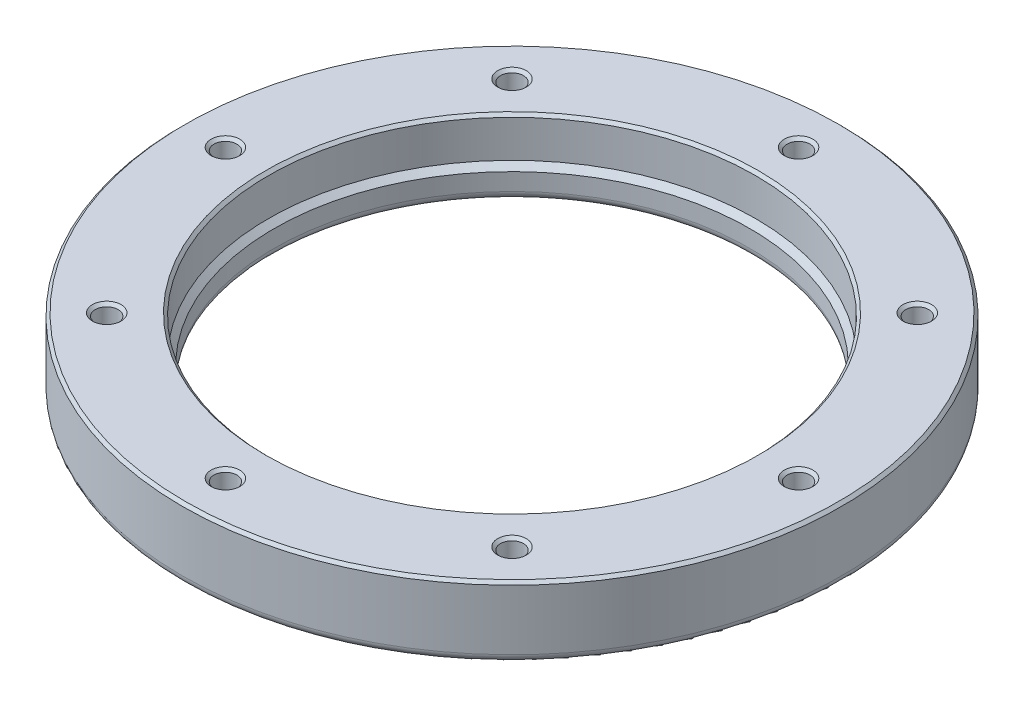
ISO-10303-21;
HEADER;
FILE_DESCRIPTION(('STEP AP214'),'2;1');
FILE_NAME('part.step','',(''),(''),'','','');
FILE_SCHEMA(('AUTOMOTIVE_DESIGN { 1 0 10303 214 1 1 1 1 }'));
ENDSEC;
DATA;
#1=APPLICATION_CONTEXT('core data for automotive mechanical design processes');
#2=APPLICATION_PROTOCOL_DEFINITION('international standard','automotive_design',2000,#1);
#3=PRODUCT_CONTEXT('',#1,'mechanical');
#4=PRODUCT('Part','Part','',(#3));
#5=PRODUCT_RELATED_PRODUCT_CATEGORY('part','',(#4));
#6=PRODUCT_DEFINITION_FORMATION('','',#4);
#7=PRODUCT_DEFINITION_CONTEXT('part definition',#1,'design');
#8=PRODUCT_DEFINITION('design','',#6,#7);
#9=PRODUCT_DEFINITION_SHAPE('','',#8);
#10=(LENGTH_UNIT() NAMED_UNIT(*) SI_UNIT(.MILLI.,.METRE.));
#11=(NAMED_UNIT(*) PLANE_ANGLE_UNIT() SI_UNIT($,.RADIAN.));
#12=(NAMED_UNIT(*) SI_UNIT($,.STERADIAN.) SOLID_ANGLE_UNIT());
#13=UNCERTAINTY_MEASURE_WITH_UNIT(LENGTH_MEASURE(1.E-05),#10,'distance_accuracy_value','');
#14=(GEOMETRIC_REPRESENTATION_CONTEXT(3) GLOBAL_UNCERTAINTY_ASSIGNED_CONTEXT((#13)) GLOBAL_UNIT_ASSIGNED_CONTEXT((#10,
#11,#12)) REPRESENTATION_CONTEXT('',''));
#15=CARTESIAN_POINT('',(0.,0.,0.));
#16=DIRECTION('',(0.,0.,1.));
#17=DIRECTION('',(1.,0.,0.));
#18=AXIS2_PLACEMENT_3D('',#15,#16,#17);
#19=CARTESIAN_POINT('',(0.,25.,0.));
#20=DIRECTION('',(0.,-1.,0.));
#21=DIRECTION('',(0.,0.,-1.));
#22=AXIS2_PLACEMENT_3D('',#19,#20,#21);
#23=CYLINDRICAL_SURFACE('',#22,115.);
#24=CARTESIAN_POINT('',(0.,3.,0.));
#25=DIRECTION('',(0.,1.,0.));
#26=DIRECTION('',(0.,0.,1.));
#27=AXIS2_PLACEMENT_3D('',#24,#25,#26);
#28=CIRCLE('',#27,115.);
#29=CARTESIAN_POINT('',(0.,3.,115.));
#30=VERTEX_POINT('',#29);
#31=EDGE_CURVE('E91',#30,#30,#28,.T.);
#32=ORIENTED_EDGE('',*,*,#31,.T.);
#33=EDGE_LOOP('',(#32));
#34=FACE_BOUND('',#33,.T.);
#35=CARTESIAN_POINT('',(0.,24.,0.));
#36=DIRECTION('',(0.,1.,0.));
#37=DIRECTION('',(0.,0.,1.));
#38=AXIS2_PLACEMENT_3D('',#35,#36,#37);
#39=CIRCLE('',#38,115.);
#40=CARTESIAN_POINT('',(0.,24.,115.));
#41=VERTEX_POINT('',#40);
#42=EDGE_CURVE('E106',#41,#41,#39,.F.);
#43=ORIENTED_EDGE('',*,*,#42,.T.);
#44=EDGE_LOOP('',(#43));
#45=FACE_BOUND('',#44,.T.);
#46=ADVANCED_FACE('F34',(#34,#45),#23,.T.);
#47=CARTESIAN_POINT('',(0.,25.,0.));
#48=DIRECTION('',(0.,1.,0.));
#49=DIRECTION('',(0.,0.,1.));
#50=AXIS2_PLACEMENT_3D('',#47,#48,#49);
#51=PLANE('',#50);
#52=CARTESIAN_POINT('',(70.7106781186547,25.,-70.7106781186548));
#53=DIRECTION('',(0.,1.,0.));
#54=DIRECTION('',(0.,0.,1.));
#55=AXIS2_PLACEMENT_3D('',#52,#53,#54);
#56=CIRCLE('',#55,5.00000000000003);
#57=CARTESIAN_POINT('',(70.7106781186547,25.,-65.7106781186547));
#58=VERTEX_POINT('',#57);
#59=EDGE_CURVE('E64',#58,#58,#56,.F.);
#60=ORIENTED_EDGE('',*,*,#59,.T.);
#61=EDGE_LOOP('',(#60));
#62=FACE_BOUND('',#61,.T.);
#63=CARTESIAN_POINT('',(100.,25.,0.));
#64=DIRECTION('',(0.,1.,0.));
#65=DIRECTION('',(0.,0.,1.));
#66=AXIS2_PLACEMENT_3D('',#63,#64,#65);
#67=CIRCLE('',#66,5.);
#68=CARTESIAN_POINT('',(100.,25.,4.99999999999998));
#69=VERTEX_POINT('',#68);
#70=EDGE_CURVE('E67',#69,#69,#67,.F.);
#71=ORIENTED_EDGE('',*,*,#70,.T.);
#72=EDGE_LOOP('',(#71));
#73=FACE_BOUND('',#72,.T.);
#74=CARTESIAN_POINT('',(70.7106781186548,25.,70.7106781186547));
#75=DIRECTION('',(0.,1.,0.));
#76=DIRECTION('',(0.,0.,1.));
#77=AXIS2_PLACEMENT_3D('',#74,#75,#76);
#78=CIRCLE('',#77,5.);
#79=CARTESIAN_POINT('',(70.7106781186548,25.,75.7106781186547));
#80=VERTEX_POINT('',#79);
#81=EDGE_CURVE('E70',#80,#80,#78,.F.);
#82=ORIENTED_EDGE('',*,*,#81,.T.);
#83=EDGE_LOOP('',(#82));
#84=FACE_BOUND('',#83,.T.);
#85=CARTESIAN_POINT('',(0.,25.,100.));
#86=DIRECTION('',(0.,1.,0.));
#87=DIRECTION('',(0.,0.,1.));
#88=AXIS2_PLACEMENT_3D('',#85,#86,#87);
#89=CIRCLE('',#88,5.);
#90=CARTESIAN_POINT('',(0.,25.,105.));
#91=VERTEX_POINT('',#90);
#92=EDGE_CURVE('E73',#91,#91,#89,.F.);
#93=ORIENTED_EDGE('',*,*,#92,.T.);
#94=EDGE_LOOP('',(#93));
#95=FACE_BOUND('',#94,.T.);
#96=CARTESIAN_POINT('',(-70.7106781186547,25.,70.7106781186548));
#97=DIRECTION('',(0.,1.,0.));
#98=DIRECTION('',(0.,0.,1.));
#99=AXIS2_PLACEMENT_3D('',#96,#97,#98);
#100=CIRCLE('',#99,5.);
#101=CARTESIAN_POINT('',(-70.7106781186547,25.,75.7106781186548));
#102=VERTEX_POINT('',#101);
#103=EDGE_CURVE('E76',#102,#102,#100,.F.);
#104=ORIENTED_EDGE('',*,*,#103,.T.);
#105=EDGE_LOOP('',(#104));
#106=FACE_BOUND('',#105,.T.);
#107=CARTESIAN_POINT('',(-100.,25.,0.));
#108=DIRECTION('',(0.,1.,0.));
#109=DIRECTION('',(0.,0.,1.));
#110=AXIS2_PLACEMENT_3D('',#107,#108,#109);
#111=CIRCLE('',#110,5.);
#112=CARTESIAN_POINT('',(-100.,25.,5.00000000000002));
#113=VERTEX_POINT('',#112);
#114=EDGE_CURVE('E79',#113,#113,#111,.F.);
#115=ORIENTED_EDGE('',*,*,#114,.T.);
#116=EDGE_LOOP('',(#115));
#117=FACE_BOUND('',#116,.T.);
#118=CARTESIAN_POINT('',(0.,25.,-100.));
#119=DIRECTION('',(0.,1.,0.));
#120=DIRECTION('',(0.,0.,1.));
#121=AXIS2_PLACEMENT_3D('',#118,#119,#120);
#122=CIRCLE('',#121,5.);
#123=CARTESIAN_POINT('',(0.,25.,-95.));
#124=VERTEX_POINT('',#123);
#125=EDGE_CURVE('E82',#124,#124,#122,.F.);
#126=ORIENTED_EDGE('',*,*,#125,.T.);
#127=EDGE_LOOP('',(#126));
#128=FACE_BOUND('',#127,.T.);
#129=CARTESIAN_POINT('',(-70.7106781186548,25.,-70.7106781186548));
#130=DIRECTION('',(0.,1.,0.));
#131=DIRECTION('',(0.,0.,1.));
#132=AXIS2_PLACEMENT_3D('',#129,#130,#131);
#133=CIRCLE('',#132,5.);
#134=CARTESIAN_POINT('',(-70.7106781186548,25.,-65.7106781186547));
#135=VERTEX_POINT('',#134);
#136=EDGE_CURVE('E85',#135,#135,#133,.F.);
#137=ORIENTED_EDGE('',*,*,#136,.T.);
#138=EDGE_LOOP('',(#137));
#139=FACE_BOUND('',#138,.T.);
#140=CARTESIAN_POINT('',(0.,25.,0.));
#141=DIRECTION('',(0.,1.,0.));
#142=DIRECTION('',(0.,0.,1.));
#143=AXIS2_PLACEMENT_3D('',#140,#141,#142);
#144=CIRCLE('',#143,114.);
#145=CARTESIAN_POINT('',(0.,25.,114.));
#146=VERTEX_POINT('',#145);
#147=EDGE_CURVE('E109',#146,#146,#144,.T.);
#148=ORIENTED_EDGE('',*,*,#147,.T.);
#149=EDGE_LOOP('',(#148));
#150=FACE_BOUND('',#149,.T.);
#151=CARTESIAN_POINT('',(0.,25.,0.));
#152=DIRECTION('',(0.,1.,0.));
#153=DIRECTION('',(0.,0.,1.));
#154=AXIS2_PLACEMENT_3D('',#151,#152,#153);
#155=CIRCLE('',#154,86.);
#156=CARTESIAN_POINT('',(0.,25.,86.));
#157=VERTEX_POINT('',#156);
#158=EDGE_CURVE('E112',#157,#157,#155,.F.);
#159=ORIENTED_EDGE('',*,*,#158,.T.);
#160=EDGE_LOOP('',(#159));
#161=FACE_BOUND('',#160,.T.);
#162=ADVANCED_FACE('F208',(#62,#73,#84,#95,#106,#117,#128,#139,#150,#161),#51,.T.);
#163=CARTESIAN_POINT('',(0.,0.,0.));
#164=DIRECTION('',(0.,1.,0.));
#165=DIRECTION('',(0.,0.,1.));
#166=AXIS2_PLACEMENT_3D('',#163,#164,#165);
#167=PLANE('',#166);
#168=CARTESIAN_POINT('',(-100.,0.,0.));
#169=DIRECTION('',(0.,-1.,0.));
#170=DIRECTION('',(0.,0.,-1.));
#171=AXIS2_PLACEMENT_3D('',#168,#169,#170);
#172=CIRCLE('',#171,6.);
#173=CARTESIAN_POINT('',(-100.,0.,-6.00000000000002));
#174=VERTEX_POINT('',#173);
#175=EDGE_CURVE('E188',#174,#174,#172,.T.);
#176=ORIENTED_EDGE('',*,*,#175,.F.);
#177=EDGE_LOOP('',(#176));
#178=FACE_BOUND('',#177,.T.);
#179=CARTESIAN_POINT('',(-70.7106781186548,0.,70.7106781186548));
#180=DIRECTION('',(0.,-1.,0.));
#181=DIRECTION('',(0.,0.,-1.));
#182=AXIS2_PLACEMENT_3D('',#179,#180,#181);
#183=CIRCLE('',#182,6.);
#184=CARTESIAN_POINT('',(-70.7106781186548,0.,64.7106781186547));
#185=VERTEX_POINT('',#184);
#186=EDGE_CURVE('E182',#185,#185,#183,.T.);
#187=ORIENTED_EDGE('',*,*,#186,.F.);
#188=EDGE_LOOP('',(#187));
#189=FACE_BOUND('',#188,.T.);
#190=CARTESIAN_POINT('',(0.,0.,100.));
#191=DIRECTION('',(0.,-1.,0.));
#192=DIRECTION('',(0.,0.,-1.));
#193=AXIS2_PLACEMENT_3D('',#190,#191,#192);
#194=CIRCLE('',#193,6.);
#195=CARTESIAN_POINT('',(0.,0.,94.));
#196=VERTEX_POINT('',#195);
#197=EDGE_CURVE('E176',#196,#196,#194,.T.);
#198=ORIENTED_EDGE('',*,*,#197,.F.);
#199=EDGE_LOOP('',(#198));
#200=FACE_BOUND('',#199,.T.);
#201=CARTESIAN_POINT('',(70.7106781186547,0.,70.7106781186548));
#202=DIRECTION('',(0.,-1.,0.));
#203=DIRECTION('',(0.,0.,-1.));
#204=AXIS2_PLACEMENT_3D('',#201,#202,#203);
#205=CIRCLE('',#204,5.99999999999999);
#206=CARTESIAN_POINT('',(70.7106781186547,0.,64.7106781186548));
#207=VERTEX_POINT('',#206);
#208=EDGE_CURVE('E170',#207,#207,#205,.T.);
#209=ORIENTED_EDGE('',*,*,#208,.F.);
#210=EDGE_LOOP('',(#209));
#211=FACE_BOUND('',#210,.T.);
#212=CARTESIAN_POINT('',(100.,0.,0.));
#213=DIRECTION('',(0.,-1.,0.));
#214=DIRECTION('',(0.,0.,-1.));
#215=AXIS2_PLACEMENT_3D('',#212,#213,#214);
#216=CIRCLE('',#215,6.);
#217=CARTESIAN_POINT('',(100.,0.,-5.99999999999998));
#218=VERTEX_POINT('',#217);
#219=EDGE_CURVE('E164',#218,#218,#216,.T.);
#220=ORIENTED_EDGE('',*,*,#219,.F.);
#221=EDGE_LOOP('',(#220));
#222=FACE_BOUND('',#221,.T.);
#223=CARTESIAN_POINT('',(70.7106781186548,0.,-70.7106781186547));
#224=DIRECTION('',(0.,-1.,0.));
#225=DIRECTION('',(0.,0.,-1.));
#226=AXIS2_PLACEMENT_3D('',#223,#224,#225);
#227=CIRCLE('',#226,6.);
#228=CARTESIAN_POINT('',(70.7106781186548,0.,-76.7106781186547));
#229=VERTEX_POINT('',#228);
#230=EDGE_CURVE('E158',#229,#229,#227,.T.);
#231=ORIENTED_EDGE('',*,*,#230,.F.);
#232=EDGE_LOOP('',(#231));
#233=FACE_BOUND('',#232,.T.);
#234=CARTESIAN_POINT('',(0.,0.,-100.));
#235=DIRECTION('',(0.,-1.,0.));
#236=DIRECTION('',(0.,0.,-1.));
#237=AXIS2_PLACEMENT_3D('',#234,#235,#236);
#238=CIRCLE('',#237,6.);
#239=CARTESIAN_POINT('',(0.,0.,-106.));
#240=VERTEX_POINT('',#239);
#241=EDGE_CURVE('E152',#240,#240,#238,.T.);
#242=ORIENTED_EDGE('',*,*,#241,.F.);
#243=EDGE_LOOP('',(#242));
#244=FACE_BOUND('',#243,.T.);
#245=CARTESIAN_POINT('',(-70.7106781186547,0.,-70.7106781186548));
#246=DIRECTION('',(0.,-1.,0.));
#247=DIRECTION('',(0.,0.,-1.));
#248=AXIS2_PLACEMENT_3D('',#245,#246,#247);
#249=CIRCLE('',#248,6.);
#250=CARTESIAN_POINT('',(-70.7106781186547,0.,-76.7106781186548));
#251=VERTEX_POINT('',#250);
#252=EDGE_CURVE('E146',#251,#251,#249,.T.);
#253=ORIENTED_EDGE('',*,*,#252,.F.);
#254=EDGE_LOOP('',(#253));
#255=FACE_BOUND('',#254,.T.);
#256=CARTESIAN_POINT('',(0.,0.,0.));
#257=DIRECTION('',(0.,1.,0.));
#258=DIRECTION('',(0.,0.,1.));
#259=AXIS2_PLACEMENT_3D('',#256,#257,#258);
#260=CIRCLE('',#259,86.);
#261=CARTESIAN_POINT('',(0.,0.,86.));
#262=VERTEX_POINT('',#261);
#263=EDGE_CURVE('E97',#262,#262,#260,.T.);
#264=ORIENTED_EDGE('',*,*,#263,.T.);
#265=EDGE_LOOP('',(#264));
#266=FACE_BOUND('',#265,.T.);
#267=CARTESIAN_POINT('',(0.,0.,0.));
#268=DIRECTION('',(0.,1.,0.));
#269=DIRECTION('',(0.,0.,1.));
#270=AXIS2_PLACEMENT_3D('',#267,#268,#269);
#271=CIRCLE('',#270,112.);
#272=CARTESIAN_POINT('',(0.,0.,112.));
#273=VERTEX_POINT('',#272);
#274=EDGE_CURVE('E100',#273,#273,#271,.F.);
#275=ORIENTED_EDGE('',*,*,#274,.T.);
#276=EDGE_LOOP('',(#275));
#277=FACE_BOUND('',#276,.T.);
#278=ADVANCED_FACE('F204',(#178,#189,#200,#211,#222,#233,#244,#255,#266,#277),#167,.F.);
#279=CARTESIAN_POINT('',(0.,9.,0.));
#280=DIRECTION('',(0.,1.,0.));
#281=DIRECTION('',(0.,0.,1.));
#282=AXIS2_PLACEMENT_3D('',#279,#280,#281);
#283=CYLINDRICAL_SURFACE('',#282,85.);
#284=CARTESIAN_POINT('',(0.,24.,0.));
#285=DIRECTION('',(0.,1.,0.));
#286=DIRECTION('',(0.,0.,1.));
#287=AXIS2_PLACEMENT_3D('',#284,#285,#286);
#288=CIRCLE('',#287,85.);
#289=CARTESIAN_POINT('',(0.,24.,85.));
#290=VERTEX_POINT('',#289);
#291=EDGE_CURVE('E103',#290,#290,#288,.T.);
#292=ORIENTED_EDGE('',*,*,#291,.T.);
#293=EDGE_LOOP('',(#292));
#294=FACE_BOUND('',#293,.T.);
#295=CARTESIAN_POINT('',(0.,10.9999999999999,0.));
#296=DIRECTION('',(0.,1.,0.));
#297=DIRECTION('',(0.,0.,1.));
#298=AXIS2_PLACEMENT_3D('',#295,#296,#297);
#299=CIRCLE('',#298,85.);
#300=CARTESIAN_POINT('',(0.,10.9999999999999,85.));
#301=VERTEX_POINT('',#300);
#302=EDGE_CURVE('E115',#301,#301,#299,.F.);
#303=ORIENTED_EDGE('',*,*,#302,.T.);
#304=EDGE_LOOP('',(#303));
#305=FACE_BOUND('',#304,.T.);
#306=ADVANCED_FACE('F207',(#294,#305),#283,.F.);
#307=CARTESIAN_POINT('',(0.,0.,0.));
#308=DIRECTION('',(0.,1.,0.));
#309=DIRECTION('',(0.,0.,1.));
#310=AXIS2_PLACEMENT_3D('',#307,#308,#309);
#311=CYLINDRICAL_SURFACE('',#310,83.);
#312=CARTESIAN_POINT('',(0.,3.,0.));
#313=DIRECTION('',(0.,1.,0.));
#314=DIRECTION('',(0.,0.,1.));
#315=AXIS2_PLACEMENT_3D('',#312,#313,#314);
#316=CIRCLE('',#315,83.);
#317=CARTESIAN_POINT('',(0.,3.,83.));
#318=VERTEX_POINT('',#317);
#319=EDGE_CURVE('E94',#318,#318,#316,.F.);
#320=ORIENTED_EDGE('',*,*,#319,.T.);
#321=EDGE_LOOP('',(#320));
#322=FACE_BOUND('',#321,.T.);
#323=CARTESIAN_POINT('',(0.,9.,0.));
#324=DIRECTION('',(0.,1.,0.));
#325=DIRECTION('',(0.,0.,1.));
#326=AXIS2_PLACEMENT_3D('',#323,#324,#325);
#327=CIRCLE('',#326,83.);
#328=CARTESIAN_POINT('',(0.,9.,83.));
#329=VERTEX_POINT('',#328);
#330=EDGE_CURVE('E118',#329,#329,#327,.T.);
#331=ORIENTED_EDGE('',*,*,#330,.T.);
#332=EDGE_LOOP('',(#331));
#333=FACE_BOUND('',#332,.T.);
#334=ADVANCED_FACE('F262',(#322,#333),#311,.F.);
#335=CARTESIAN_POINT('',(0.,9.,0.));
#336=DIRECTION('',(0.,1.,0.));
#337=DIRECTION('',(0.,0.,1.));
#338=AXIS2_PLACEMENT_3D('',#335,#336,#337);
#339=CONICAL_SURFACE('',#338,83.0000000000001,0.785398163397445);
#340=ORIENTED_EDGE('',*,*,#302,.F.);
#341=EDGE_LOOP('',(#340));
#342=FACE_BOUND('',#341,.T.);
#343=ORIENTED_EDGE('',*,*,#330,.F.);
#344=EDGE_LOOP('',(#343));
#345=FACE_BOUND('',#344,.T.);
#346=ADVANCED_FACE('F245',(#342,#345),#339,.F.);
#347=CARTESIAN_POINT('',(0.,25.,0.));
#348=DIRECTION('',(0.,-1.,0.));
#349=DIRECTION('',(0.,0.,-1.));
#350=AXIS2_PLACEMENT_3D('',#347,#348,#349);
#351=CONICAL_SURFACE('',#350,114.,0.785398163397462);
#352=ORIENTED_EDGE('',*,*,#42,.F.);
#353=EDGE_LOOP('',(#352));
#354=FACE_BOUND('',#353,.T.);
#355=ORIENTED_EDGE('',*,*,#147,.F.);
#356=EDGE_LOOP('',(#355));
#357=FACE_BOUND('',#356,.T.);
#358=ADVANCED_FACE('F241',(#354,#357),#351,.T.);
#359=CARTESIAN_POINT('',(0.,24.,0.));
#360=DIRECTION('',(0.,1.,0.));
#361=DIRECTION('',(0.,0.,1.));
#362=AXIS2_PLACEMENT_3D('',#359,#360,#361);
#363=CONICAL_SURFACE('',#362,85.,0.785398163397455);
#364=ORIENTED_EDGE('',*,*,#158,.F.);
#365=EDGE_LOOP('',(#364));
#366=FACE_BOUND('',#365,.T.);
#367=ORIENTED_EDGE('',*,*,#291,.F.);
#368=EDGE_LOOP('',(#367));
#369=FACE_BOUND('',#368,.T.);
#370=ADVANCED_FACE('F244',(#366,#369),#363,.F.);
#371=CARTESIAN_POINT('',(0.,3.,0.));
#372=DIRECTION('',(0.,1.,0.));
#373=DIRECTION('',(0.,0.,1.));
#374=AXIS2_PLACEMENT_3D('',#371,#372,#373);
#375=TOROIDAL_SURFACE('',#374,86.,3.);
#376=ORIENTED_EDGE('',*,*,#319,.F.);
#377=EDGE_LOOP('',(#376));
#378=FACE_BOUND('',#377,.T.);
#379=ORIENTED_EDGE('',*,*,#263,.F.);
#380=EDGE_LOOP('',(#379));
#381=FACE_BOUND('',#380,.T.);
#382=ADVANCED_FACE('F232',(#378,#381),#375,.T.);
#383=CARTESIAN_POINT('',(0.,3.,0.));
#384=DIRECTION('',(0.,1.,0.));
#385=DIRECTION('',(0.,0.,1.));
#386=AXIS2_PLACEMENT_3D('',#383,#384,#385);
#387=TOROIDAL_SURFACE('',#386,112.,3.);
#388=ORIENTED_EDGE('',*,*,#274,.F.);
#389=EDGE_LOOP('',(#388));
#390=FACE_BOUND('',#389,.T.);
#391=ORIENTED_EDGE('',*,*,#31,.F.);
#392=EDGE_LOOP('',(#391));
#393=FACE_BOUND('',#392,.T.);
#394=ADVANCED_FACE('F228',(#390,#393),#387,.T.);
#395=CARTESIAN_POINT('',(-70.7106781186547,10.,70.7106781186548));
#396=DIRECTION('',(0.,1.,0.));
#397=DIRECTION('',(0.,0.,1.));
#398=AXIS2_PLACEMENT_3D('',#395,#396,#397);
#399=CYLINDRICAL_SURFACE('',#398,4.00000000000001);
#400=CARTESIAN_POINT('',(-70.7106781186547,24.,70.7106781186548));
#401=DIRECTION('',(0.,1.,0.));
#402=DIRECTION('',(0.,0.,1.));
#403=AXIS2_PLACEMENT_3D('',#400,#401,#402);
#404=CIRCLE('',#403,4.00000000000001);
#405=CARTESIAN_POINT('',(-70.7106781186547,24.,74.7106781186548));
#406=VERTEX_POINT('',#405);
#407=EDGE_CURVE('E50',#406,#406,#404,.T.);
#408=ORIENTED_EDGE('',*,*,#407,.T.);
#409=EDGE_LOOP('',(#408));
#410=FACE_BOUND('',#409,.T.);
#411=CARTESIAN_POINT('',(-70.7106781186547,10.,70.7106781186548));
#412=DIRECTION('',(0.,1.,0.));
#413=DIRECTION('',(0.,0.,1.));
#414=AXIS2_PLACEMENT_3D('',#411,#412,#413);
#415=CIRCLE('',#414,4.00000000000001);
#416=CARTESIAN_POINT('',(-70.7106781186547,10.,74.7106781186548));
#417=VERTEX_POINT('',#416);
#418=EDGE_CURVE('E121',#417,#417,#415,.T.);
#419=ORIENTED_EDGE('',*,*,#418,.F.);
#420=EDGE_LOOP('',(#419));
#421=FACE_BOUND('',#420,.T.);
#422=ADVANCED_FACE('F231',(#410,#421),#399,.F.);
#423=CARTESIAN_POINT('',(0.,10.,100.));
#424=DIRECTION('',(0.,1.,0.));
#425=DIRECTION('',(0.,0.,1.));
#426=AXIS2_PLACEMENT_3D('',#423,#424,#425);
#427=CYLINDRICAL_SURFACE('',#426,4.00000000000001);
#428=CARTESIAN_POINT('',(0.,24.,100.));
#429=DIRECTION('',(0.,1.,0.));
#430=DIRECTION('',(0.,0.,1.));
#431=AXIS2_PLACEMENT_3D('',#428,#429,#430);
#432=CIRCLE('',#431,4.00000000000001);
#433=CARTESIAN_POINT('',(0.,24.,104.));
#434=VERTEX_POINT('',#433);
#435=EDGE_CURVE('E55',#434,#434,#432,.T.);
#436=ORIENTED_EDGE('',*,*,#435,.T.);
#437=EDGE_LOOP('',(#436));
#438=FACE_BOUND('',#437,.T.);
#439=CARTESIAN_POINT('',(0.,10.,100.));
#440=DIRECTION('',(0.,1.,0.));
#441=DIRECTION('',(0.,0.,1.));
#442=AXIS2_PLACEMENT_3D('',#439,#440,#441);
#443=CIRCLE('',#442,4.00000000000001);
#444=CARTESIAN_POINT('',(0.,10.,104.));
#445=VERTEX_POINT('',#444);
#446=EDGE_CURVE('E124',#445,#445,#443,.T.);
#447=ORIENTED_EDGE('',*,*,#446,.F.);
#448=EDGE_LOOP('',(#447));
#449=FACE_BOUND('',#448,.T.);
#450=ADVANCED_FACE('F451',(#438,#449),#427,.F.);
#451=CARTESIAN_POINT('',(70.7106781186548,10.,70.7106781186547));
#452=DIRECTION('',(0.,1.,0.));
#453=DIRECTION('',(0.,0.,1.));
#454=AXIS2_PLACEMENT_3D('',#451,#452,#453);
#455=CYLINDRICAL_SURFACE('',#454,4.00000000000002);
#456=CARTESIAN_POINT('',(70.7106781186548,24.,70.7106781186547));
#457=DIRECTION('',(0.,1.,0.));
#458=DIRECTION('',(0.,0.,1.));
#459=AXIS2_PLACEMENT_3D('',#456,#457,#458);
#460=CIRCLE('',#459,4.00000000000002);
#461=CARTESIAN_POINT('',(70.7106781186548,24.,74.7106781186548));
#462=VERTEX_POINT('',#461);
#463=EDGE_CURVE('E58',#462,#462,#460,.T.);
#464=ORIENTED_EDGE('',*,*,#463,.T.);
#465=EDGE_LOOP('',(#464));
#466=FACE_BOUND('',#465,.T.);
#467=CARTESIAN_POINT('',(70.7106781186548,10.,70.7106781186547));
#468=DIRECTION('',(0.,1.,0.));
#469=DIRECTION('',(0.,0.,1.));
#470=AXIS2_PLACEMENT_3D('',#467,#468,#469);
#471=CIRCLE('',#470,4.00000000000002);
#472=CARTESIAN_POINT('',(70.7106781186548,10.,74.7106781186548));
#473=VERTEX_POINT('',#472);
#474=EDGE_CURVE('E127',#473,#473,#471,.T.);
#475=ORIENTED_EDGE('',*,*,#474,.F.);
#476=EDGE_LOOP('',(#475));
#477=FACE_BOUND('',#476,.T.);
#478=ADVANCED_FACE('F441',(#466,#477),#455,.F.);
#479=CARTESIAN_POINT('',(100.,10.,0.));
#480=DIRECTION('',(0.,1.,0.));
#481=DIRECTION('',(0.,0.,1.));
#482=AXIS2_PLACEMENT_3D('',#479,#480,#481);
#483=CYLINDRICAL_SURFACE('',#482,4.00000000000002);
#484=CARTESIAN_POINT('',(100.,24.,0.));
#485=DIRECTION('',(0.,1.,0.));
#486=DIRECTION('',(0.,0.,1.));
#487=AXIS2_PLACEMENT_3D('',#484,#485,#486);
#488=CIRCLE('',#487,4.00000000000002);
#489=CARTESIAN_POINT('',(100.,24.,3.99999999999999));
#490=VERTEX_POINT('',#489);
#491=EDGE_CURVE('E61',#490,#490,#488,.T.);
#492=ORIENTED_EDGE('',*,*,#491,.T.);
#493=EDGE_LOOP('',(#492));
#494=FACE_BOUND('',#493,.T.);
#495=CARTESIAN_POINT('',(100.,10.,0.));
#496=DIRECTION('',(0.,1.,0.));
#497=DIRECTION('',(0.,0.,1.));
#498=AXIS2_PLACEMENT_3D('',#495,#496,#497);
#499=CIRCLE('',#498,4.00000000000002);
#500=CARTESIAN_POINT('',(100.,10.,3.99999999999999));
#501=VERTEX_POINT('',#500);
#502=EDGE_CURVE('E130',#501,#501,#499,.T.);
#503=ORIENTED_EDGE('',*,*,#502,.F.);
#504=EDGE_LOOP('',(#503));
#505=FACE_BOUND('',#504,.T.);
#506=ADVANCED_FACE('F431',(#494,#505),#483,.F.);
#507=CARTESIAN_POINT('',(70.7106781186547,10.,-70.7106781186548));
#508=DIRECTION('',(0.,1.,0.));
#509=DIRECTION('',(0.,0.,1.));
#510=AXIS2_PLACEMENT_3D('',#507,#508,#509);
#511=CYLINDRICAL_SURFACE('',#510,4.00000000000001);
#512=CARTESIAN_POINT('',(70.7106781186547,24.,-70.7106781186548));
#513=DIRECTION('',(0.,1.,0.));
#514=DIRECTION('',(0.,0.,1.));
#515=AXIS2_PLACEMENT_3D('',#512,#513,#514);
#516=CIRCLE('',#515,4.00000000000001);
#517=CARTESIAN_POINT('',(70.7106781186547,24.,-66.7106781186548));
#518=VERTEX_POINT('',#517);
#519=EDGE_CURVE('E88',#518,#518,#516,.T.);
#520=ORIENTED_EDGE('',*,*,#519,.T.);
#521=EDGE_LOOP('',(#520));
#522=FACE_BOUND('',#521,.T.);
#523=CARTESIAN_POINT('',(70.7106781186547,10.,-70.7106781186548));
#524=DIRECTION('',(0.,1.,0.));
#525=DIRECTION('',(0.,0.,1.));
#526=AXIS2_PLACEMENT_3D('',#523,#524,#525);
#527=CIRCLE('',#526,4.00000000000001);
#528=CARTESIAN_POINT('',(70.7106781186547,10.,-66.7106781186548));
#529=VERTEX_POINT('',#528);
#530=EDGE_CURVE('E133',#529,#529,#527,.T.);
#531=ORIENTED_EDGE('',*,*,#530,.F.);
#532=EDGE_LOOP('',(#531));
#533=FACE_BOUND('',#532,.T.);
#534=ADVANCED_FACE('F422',(#522,#533),#511,.F.);
#535=CARTESIAN_POINT('',(0.,10.,-100.));
#536=DIRECTION('',(0.,1.,0.));
#537=DIRECTION('',(0.,0.,1.));
#538=AXIS2_PLACEMENT_3D('',#535,#536,#537);
#539=CYLINDRICAL_SURFACE('',#538,4.);
#540=CARTESIAN_POINT('',(0.,24.,-100.));
#541=DIRECTION('',(0.,1.,0.));
#542=DIRECTION('',(0.,0.,1.));
#543=AXIS2_PLACEMENT_3D('',#540,#541,#542);
#544=CIRCLE('',#543,4.);
#545=CARTESIAN_POINT('',(0.,24.,-96.));
#546=VERTEX_POINT('',#545);
#547=EDGE_CURVE('E42',#546,#546,#544,.T.);
#548=ORIENTED_EDGE('',*,*,#547,.T.);
#549=EDGE_LOOP('',(#548));
#550=FACE_BOUND('',#549,.T.);
#551=CARTESIAN_POINT('',(0.,10.,-100.));
#552=DIRECTION('',(0.,1.,0.));
#553=DIRECTION('',(0.,0.,1.));
#554=AXIS2_PLACEMENT_3D('',#551,#552,#553);
#555=CIRCLE('',#554,4.);
#556=CARTESIAN_POINT('',(0.,10.,-96.));
#557=VERTEX_POINT('',#556);
#558=EDGE_CURVE('E136',#557,#557,#555,.T.);
#559=ORIENTED_EDGE('',*,*,#558,.F.);
#560=EDGE_LOOP('',(#559));
#561=FACE_BOUND('',#560,.T.);
#562=ADVANCED_FACE('F413',(#550,#561),#539,.F.);
#563=CARTESIAN_POINT('',(-70.7106781186548,10.,-70.7106781186548));
#564=DIRECTION('',(0.,1.,0.));
#565=DIRECTION('',(0.,0.,1.));
#566=AXIS2_PLACEMENT_3D('',#563,#564,#565);
#567=CYLINDRICAL_SURFACE('',#566,4.00000000000001);
#568=CARTESIAN_POINT('',(-70.7106781186548,24.,-70.7106781186548));
#569=DIRECTION('',(0.,1.,0.));
#570=DIRECTION('',(0.,0.,1.));
#571=AXIS2_PLACEMENT_3D('',#568,#569,#570);
#572=CIRCLE('',#571,4.00000000000001);
#573=CARTESIAN_POINT('',(-70.7106781186548,24.,-66.7106781186548));
#574=VERTEX_POINT('',#573);
#575=EDGE_CURVE('E10',#574,#574,#572,.T.);
#576=ORIENTED_EDGE('',*,*,#575,.T.);
#577=EDGE_LOOP('',(#576));
#578=FACE_BOUND('',#577,.T.);
#579=CARTESIAN_POINT('',(-70.7106781186548,10.,-70.7106781186548));
#580=DIRECTION('',(0.,1.,0.));
#581=DIRECTION('',(0.,0.,1.));
#582=AXIS2_PLACEMENT_3D('',#579,#580,#581);
#583=CIRCLE('',#582,4.00000000000001);
#584=CARTESIAN_POINT('',(-70.7106781186548,10.,-66.7106781186548));
#585=VERTEX_POINT('',#584);
#586=EDGE_CURVE('E139',#585,#585,#583,.T.);
#587=ORIENTED_EDGE('',*,*,#586,.F.);
#588=EDGE_LOOP('',(#587));
#589=FACE_BOUND('',#588,.T.);
#590=ADVANCED_FACE('F401',(#578,#589),#567,.F.);
#591=CARTESIAN_POINT('',(-100.,10.,0.));
#592=DIRECTION('',(0.,1.,0.));
#593=DIRECTION('',(0.,0.,1.));
#594=AXIS2_PLACEMENT_3D('',#591,#592,#593);
#595=CYLINDRICAL_SURFACE('',#594,4.00000000000001);
#596=CARTESIAN_POINT('',(-100.,24.,0.));
#597=DIRECTION('',(0.,1.,0.));
#598=DIRECTION('',(0.,0.,1.));
#599=AXIS2_PLACEMENT_3D('',#596,#597,#598);
#600=CIRCLE('',#599,4.00000000000001);
#601=CARTESIAN_POINT('',(-100.,24.,4.00000000000002));
#602=VERTEX_POINT('',#601);
#603=EDGE_CURVE('E46',#602,#602,#600,.T.);
#604=ORIENTED_EDGE('',*,*,#603,.T.);
#605=EDGE_LOOP('',(#604));
#606=FACE_BOUND('',#605,.T.);
#607=CARTESIAN_POINT('',(-100.,10.,0.));
#608=DIRECTION('',(0.,1.,0.));
#609=DIRECTION('',(0.,0.,1.));
#610=AXIS2_PLACEMENT_3D('',#607,#608,#609);
#611=CIRCLE('',#610,4.00000000000001);
#612=CARTESIAN_POINT('',(-100.,10.,4.00000000000002));
#613=VERTEX_POINT('',#612);
#614=EDGE_CURVE('E142',#613,#613,#611,.T.);
#615=ORIENTED_EDGE('',*,*,#614,.F.);
#616=EDGE_LOOP('',(#615));
#617=FACE_BOUND('',#616,.T.);
#618=ADVANCED_FACE('F395',(#606,#617),#595,.F.);
#619=CARTESIAN_POINT('',(-70.7106781186547,10.,-70.7106781186548));
#620=DIRECTION('',(0.,-1.,0.));
#621=DIRECTION('',(0.,0.,-1.));
#622=AXIS2_PLACEMENT_3D('',#619,#620,#621);
#623=PLANE('',#622);
#624=CARTESIAN_POINT('',(-70.7106781186547,10.,-70.7106781186548));
#625=DIRECTION('',(0.,-1.,0.));
#626=DIRECTION('',(0.,0.,-1.));
#627=AXIS2_PLACEMENT_3D('',#624,#625,#626);
#628=CIRCLE('',#627,6.);
#629=CARTESIAN_POINT('',(-70.7106781186547,10.,-76.7106781186548));
#630=VERTEX_POINT('',#629);
#631=EDGE_CURVE('E149',#630,#630,#628,.T.);
#632=ORIENTED_EDGE('',*,*,#631,.T.);
#633=EDGE_LOOP('',(#632));
#634=FACE_BOUND('',#633,.T.);
#635=ORIENTED_EDGE('',*,*,#586,.T.);
#636=EDGE_LOOP('',(#635));
#637=FACE_BOUND('',#636,.T.);
#638=ADVANCED_FACE('F400',(#634,#637),#623,.T.);
#639=CARTESIAN_POINT('',(-70.7106781186547,10.,-70.7106781186548));
#640=DIRECTION('',(0.,-1.,0.));
#641=DIRECTION('',(0.,0.,-1.));
#642=AXIS2_PLACEMENT_3D('',#639,#640,#641);
#643=CYLINDRICAL_SURFACE('',#642,6.);
#644=ORIENTED_EDGE('',*,*,#631,.F.);
#645=EDGE_LOOP('',(#644));
#646=FACE_BOUND('',#645,.T.);
#647=ORIENTED_EDGE('',*,*,#252,.T.);
#648=EDGE_LOOP('',(#647));
#649=FACE_BOUND('',#648,.T.);
#650=ADVANCED_FACE('F610',(#646,#649),#643,.F.);
#651=CARTESIAN_POINT('',(0.,10.,-100.));
#652=DIRECTION('',(0.,-1.,0.));
#653=DIRECTION('',(0.,0.,-1.));
#654=AXIS2_PLACEMENT_3D('',#651,#652,#653);
#655=PLANE('',#654);
#656=CARTESIAN_POINT('',(0.,10.,-100.));
#657=DIRECTION('',(0.,-1.,0.));
#658=DIRECTION('',(0.,0.,-1.));
#659=AXIS2_PLACEMENT_3D('',#656,#657,#658);
#660=CIRCLE('',#659,6.);
#661=CARTESIAN_POINT('',(0.,10.,-106.));
#662=VERTEX_POINT('',#661);
#663=EDGE_CURVE('E155',#662,#662,#660,.T.);
#664=ORIENTED_EDGE('',*,*,#663,.T.);
#665=EDGE_LOOP('',(#664));
#666=FACE_BOUND('',#665,.T.);
#667=ORIENTED_EDGE('',*,*,#558,.T.);
#668=EDGE_LOOP('',(#667));
#669=FACE_BOUND('',#668,.T.);
#670=ADVANCED_FACE('F600',(#666,#669),#655,.T.);
#671=CARTESIAN_POINT('',(0.,10.,-100.));
#672=DIRECTION('',(0.,-1.,0.));
#673=DIRECTION('',(0.,0.,-1.));
#674=AXIS2_PLACEMENT_3D('',#671,#672,#673);
#675=CYLINDRICAL_SURFACE('',#674,6.);
#676=ORIENTED_EDGE('',*,*,#663,.F.);
#677=EDGE_LOOP('',(#676));
#678=FACE_BOUND('',#677,.T.);
#679=ORIENTED_EDGE('',*,*,#241,.T.);
#680=EDGE_LOOP('',(#679));
#681=FACE_BOUND('',#680,.T.);
#682=ADVANCED_FACE('F590',(#678,#681),#675,.F.);
#683=CARTESIAN_POINT('',(70.7106781186548,10.,-70.7106781186547));
#684=DIRECTION('',(0.,-1.,0.));
#685=DIRECTION('',(0.,0.,-1.));
#686=AXIS2_PLACEMENT_3D('',#683,#684,#685);
#687=PLANE('',#686);
#688=CARTESIAN_POINT('',(70.7106781186548,10.,-70.7106781186547));
#689=DIRECTION('',(0.,-1.,0.));
#690=DIRECTION('',(0.,0.,-1.));
#691=AXIS2_PLACEMENT_3D('',#688,#689,#690);
#692=CIRCLE('',#691,6.);
#693=CARTESIAN_POINT('',(70.7106781186548,10.,-76.7106781186547));
#694=VERTEX_POINT('',#693);
#695=EDGE_CURVE('E161',#694,#694,#692,.T.);
#696=ORIENTED_EDGE('',*,*,#695,.T.);
#697=EDGE_LOOP('',(#696));
#698=FACE_BOUND('',#697,.T.);
#699=ORIENTED_EDGE('',*,*,#530,.T.);
#700=EDGE_LOOP('',(#699));
#701=FACE_BOUND('',#700,.T.);
#702=ADVANCED_FACE('F580',(#698,#701),#687,.T.);
#703=CARTESIAN_POINT('',(70.7106781186548,10.,-70.7106781186547));
#704=DIRECTION('',(0.,-1.,0.));
#705=DIRECTION('',(0.,0.,-1.));
#706=AXIS2_PLACEMENT_3D('',#703,#704,#705);
#707=CYLINDRICAL_SURFACE('',#706,6.);
#708=ORIENTED_EDGE('',*,*,#695,.F.);
#709=EDGE_LOOP('',(#708));
#710=FACE_BOUND('',#709,.T.);
#711=ORIENTED_EDGE('',*,*,#230,.T.);
#712=EDGE_LOOP('',(#711));
#713=FACE_BOUND('',#712,.T.);
#714=ADVANCED_FACE('F570',(#710,#713),#707,.F.);
#715=CARTESIAN_POINT('',(100.,10.,0.));
#716=DIRECTION('',(0.,-1.,0.));
#717=DIRECTION('',(0.,0.,-1.));
#718=AXIS2_PLACEMENT_3D('',#715,#716,#717);
#719=PLANE('',#718);
#720=CARTESIAN_POINT('',(100.,10.,0.));
#721=DIRECTION('',(0.,-1.,0.));
#722=DIRECTION('',(0.,0.,-1.));
#723=AXIS2_PLACEMENT_3D('',#720,#721,#722);
#724=CIRCLE('',#723,6.);
#725=CARTESIAN_POINT('',(100.,10.,-5.99999999999998));
#726=VERTEX_POINT('',#725);
#727=EDGE_CURVE('E167',#726,#726,#724,.T.);
#728=ORIENTED_EDGE('',*,*,#727,.T.);
#729=EDGE_LOOP('',(#728));
#730=FACE_BOUND('',#729,.T.);
#731=ORIENTED_EDGE('',*,*,#502,.T.);
#732=EDGE_LOOP('',(#731));
#733=FACE_BOUND('',#732,.T.);
#734=ADVANCED_FACE('F560',(#730,#733),#719,.T.);
#735=CARTESIAN_POINT('',(100.,10.,0.));
#736=DIRECTION('',(0.,-1.,0.));
#737=DIRECTION('',(0.,0.,-1.));
#738=AXIS2_PLACEMENT_3D('',#735,#736,#737);
#739=CYLINDRICAL_SURFACE('',#738,6.);
#740=ORIENTED_EDGE('',*,*,#727,.F.);
#741=EDGE_LOOP('',(#740));
#742=FACE_BOUND('',#741,.T.);
#743=ORIENTED_EDGE('',*,*,#219,.T.);
#744=EDGE_LOOP('',(#743));
#745=FACE_BOUND('',#744,.T.);
#746=ADVANCED_FACE('F550',(#742,#745),#739,.F.);
#747=CARTESIAN_POINT('',(70.7106781186547,10.,70.7106781186548));
#748=DIRECTION('',(0.,-1.,0.));
#749=DIRECTION('',(0.,0.,-1.));
#750=AXIS2_PLACEMENT_3D('',#747,#748,#749);
#751=PLANE('',#750);
#752=CARTESIAN_POINT('',(70.7106781186547,10.,70.7106781186548));
#753=DIRECTION('',(0.,-1.,0.));
#754=DIRECTION('',(0.,0.,-1.));
#755=AXIS2_PLACEMENT_3D('',#752,#753,#754);
#756=CIRCLE('',#755,5.99999999999999);
#757=CARTESIAN_POINT('',(70.7106781186547,10.,64.7106781186548));
#758=VERTEX_POINT('',#757);
#759=EDGE_CURVE('E173',#758,#758,#756,.T.);
#760=ORIENTED_EDGE('',*,*,#759,.T.);
#761=EDGE_LOOP('',(#760));
#762=FACE_BOUND('',#761,.T.);
#763=ORIENTED_EDGE('',*,*,#474,.T.);
#764=EDGE_LOOP('',(#763));
#765=FACE_BOUND('',#764,.T.);
#766=ADVANCED_FACE('F540',(#762,#765),#751,.T.);
#767=CARTESIAN_POINT('',(70.7106781186547,10.,70.7106781186548));
#768=DIRECTION('',(0.,-1.,0.));
#769=DIRECTION('',(0.,0.,-1.));
#770=AXIS2_PLACEMENT_3D('',#767,#768,#769);
#771=CYLINDRICAL_SURFACE('',#770,5.99999999999999);
#772=ORIENTED_EDGE('',*,*,#759,.F.);
#773=EDGE_LOOP('',(#772));
#774=FACE_BOUND('',#773,.T.);
#775=ORIENTED_EDGE('',*,*,#208,.T.);
#776=EDGE_LOOP('',(#775));
#777=FACE_BOUND('',#776,.T.);
#778=ADVANCED_FACE('F530',(#774,#777),#771,.F.);
#779=CARTESIAN_POINT('',(0.,10.,100.));
#780=DIRECTION('',(0.,-1.,0.));
#781=DIRECTION('',(0.,0.,-1.));
#782=AXIS2_PLACEMENT_3D('',#779,#780,#781);
#783=PLANE('',#782);
#784=CARTESIAN_POINT('',(0.,10.,100.));
#785=DIRECTION('',(0.,-1.,0.));
#786=DIRECTION('',(0.,0.,-1.));
#787=AXIS2_PLACEMENT_3D('',#784,#785,#786);
#788=CIRCLE('',#787,6.);
#789=CARTESIAN_POINT('',(0.,10.,94.));
#790=VERTEX_POINT('',#789);
#791=EDGE_CURVE('E179',#790,#790,#788,.T.);
#792=ORIENTED_EDGE('',*,*,#791,.T.);
#793=EDGE_LOOP('',(#792));
#794=FACE_BOUND('',#793,.T.);
#795=ORIENTED_EDGE('',*,*,#446,.T.);
#796=EDGE_LOOP('',(#795));
#797=FACE_BOUND('',#796,.T.);
#798=ADVANCED_FACE('F520',(#794,#797),#783,.T.);
#799=CARTESIAN_POINT('',(0.,10.,100.));
#800=DIRECTION('',(0.,-1.,0.));
#801=DIRECTION('',(0.,0.,-1.));
#802=AXIS2_PLACEMENT_3D('',#799,#800,#801);
#803=CYLINDRICAL_SURFACE('',#802,6.);
#804=ORIENTED_EDGE('',*,*,#791,.F.);
#805=EDGE_LOOP('',(#804));
#806=FACE_BOUND('',#805,.T.);
#807=ORIENTED_EDGE('',*,*,#197,.T.);
#808=EDGE_LOOP('',(#807));
#809=FACE_BOUND('',#808,.T.);
#810=ADVANCED_FACE('F510',(#806,#809),#803,.F.);
#811=CARTESIAN_POINT('',(-70.7106781186548,10.,70.7106781186548));
#812=DIRECTION('',(0.,-1.,0.));
#813=DIRECTION('',(0.,0.,-1.));
#814=AXIS2_PLACEMENT_3D('',#811,#812,#813);
#815=PLANE('',#814);
#816=CARTESIAN_POINT('',(-70.7106781186548,10.,70.7106781186548));
#817=DIRECTION('',(0.,-1.,0.));
#818=DIRECTION('',(0.,0.,-1.));
#819=AXIS2_PLACEMENT_3D('',#816,#817,#818);
#820=CIRCLE('',#819,6.);
#821=CARTESIAN_POINT('',(-70.7106781186548,10.,64.7106781186547));
#822=VERTEX_POINT('',#821);
#823=EDGE_CURVE('E185',#822,#822,#820,.T.);
#824=ORIENTED_EDGE('',*,*,#823,.T.);
#825=EDGE_LOOP('',(#824));
#826=FACE_BOUND('',#825,.T.);
#827=ORIENTED_EDGE('',*,*,#418,.T.);
#828=EDGE_LOOP('',(#827));
#829=FACE_BOUND('',#828,.T.);
#830=ADVANCED_FACE('F500',(#826,#829),#815,.T.);
#831=CARTESIAN_POINT('',(-70.7106781186548,10.,70.7106781186548));
#832=DIRECTION('',(0.,-1.,0.));
#833=DIRECTION('',(0.,0.,-1.));
#834=AXIS2_PLACEMENT_3D('',#831,#832,#833);
#835=CYLINDRICAL_SURFACE('',#834,6.);
#836=ORIENTED_EDGE('',*,*,#823,.F.);
#837=EDGE_LOOP('',(#836));
#838=FACE_BOUND('',#837,.T.);
#839=ORIENTED_EDGE('',*,*,#186,.T.);
#840=EDGE_LOOP('',(#839));
#841=FACE_BOUND('',#840,.T.);
#842=ADVANCED_FACE('F491',(#838,#841),#835,.F.);
#843=CARTESIAN_POINT('',(-100.,10.,0.));
#844=DIRECTION('',(0.,-1.,0.));
#845=DIRECTION('',(0.,0.,-1.));
#846=AXIS2_PLACEMENT_3D('',#843,#844,#845);
#847=PLANE('',#846);
#848=CARTESIAN_POINT('',(-100.,10.,0.));
#849=DIRECTION('',(0.,-1.,0.));
#850=DIRECTION('',(0.,0.,-1.));
#851=AXIS2_PLACEMENT_3D('',#848,#849,#850);
#852=CIRCLE('',#851,6.);
#853=CARTESIAN_POINT('',(-100.,10.,-6.00000000000002));
#854=VERTEX_POINT('',#853);
#855=EDGE_CURVE('E145',#854,#854,#852,.T.);
#856=ORIENTED_EDGE('',*,*,#855,.T.);
#857=EDGE_LOOP('',(#856));
#858=FACE_BOUND('',#857,.T.);
#859=ORIENTED_EDGE('',*,*,#614,.T.);
#860=EDGE_LOOP('',(#859));
#861=FACE_BOUND('',#860,.T.);
#862=ADVANCED_FACE('F194',(#858,#861),#847,.T.);
#863=CARTESIAN_POINT('',(-100.,10.,0.));
#864=DIRECTION('',(0.,-1.,0.));
#865=DIRECTION('',(0.,0.,-1.));
#866=AXIS2_PLACEMENT_3D('',#863,#864,#865);
#867=CYLINDRICAL_SURFACE('',#866,6.);
#868=ORIENTED_EDGE('',*,*,#855,.F.);
#869=EDGE_LOOP('',(#868));
#870=FACE_BOUND('',#869,.T.);
#871=ORIENTED_EDGE('',*,*,#175,.T.);
#872=EDGE_LOOP('',(#871));
#873=FACE_BOUND('',#872,.T.);
#874=ADVANCED_FACE('F197',(#870,#873),#867,.F.);
#875=CARTESIAN_POINT('',(70.7106781186547,24.,-70.7106781186548));
#876=DIRECTION('',(0.,1.,0.));
#877=DIRECTION('',(0.,0.,1.));
#878=AXIS2_PLACEMENT_3D('',#875,#876,#877);
#879=CONICAL_SURFACE('',#878,4.00000000000001,0.785398163397455);
#880=ORIENTED_EDGE('',*,*,#59,.F.);
#881=EDGE_LOOP('',(#880));
#882=FACE_BOUND('',#881,.T.);
#883=ORIENTED_EDGE('',*,*,#519,.F.);
#884=EDGE_LOOP('',(#883));
#885=FACE_BOUND('',#884,.T.);
#886=ADVANCED_FACE('F200',(#882,#885),#879,.F.);
#887=CARTESIAN_POINT('',(100.,24.,0.));
#888=DIRECTION('',(0.,1.,0.));
#889=DIRECTION('',(0.,0.,1.));
#890=AXIS2_PLACEMENT_3D('',#887,#888,#889);
#891=CONICAL_SURFACE('',#890,4.00000000000002,0.785398163397455);
#892=ORIENTED_EDGE('',*,*,#70,.F.);
#893=EDGE_LOOP('',(#892));
#894=FACE_BOUND('',#893,.T.);
#895=ORIENTED_EDGE('',*,*,#491,.F.);
#896=EDGE_LOOP('',(#895));
#897=FACE_BOUND('',#896,.T.);
#898=ADVANCED_FACE('F297',(#894,#897),#891,.F.);
#899=CARTESIAN_POINT('',(70.7106781186548,24.,70.7106781186547));
#900=DIRECTION('',(0.,1.,0.));
#901=DIRECTION('',(0.,0.,1.));
#902=AXIS2_PLACEMENT_3D('',#899,#900,#901);
#903=CONICAL_SURFACE('',#902,4.00000000000002,0.785398163397456);
#904=ORIENTED_EDGE('',*,*,#81,.F.);
#905=EDGE_LOOP('',(#904));
#906=FACE_BOUND('',#905,.T.);
#907=ORIENTED_EDGE('',*,*,#463,.F.);
#908=EDGE_LOOP('',(#907));
#909=FACE_BOUND('',#908,.T.);
#910=ADVANCED_FACE('F304',(#906,#909),#903,.F.);
#911=CARTESIAN_POINT('',(0.,24.,100.));
#912=DIRECTION('',(0.,1.,0.));
#913=DIRECTION('',(0.,0.,1.));
#914=AXIS2_PLACEMENT_3D('',#911,#912,#913);
#915=CONICAL_SURFACE('',#914,4.00000000000001,0.785398163397455);
#916=ORIENTED_EDGE('',*,*,#92,.F.);
#917=EDGE_LOOP('',(#916));
#918=FACE_BOUND('',#917,.T.);
#919=ORIENTED_EDGE('',*,*,#435,.F.);
#920=EDGE_LOOP('',(#919));
#921=FACE_BOUND('',#920,.T.);
#922=ADVANCED_FACE('F311',(#918,#921),#915,.F.);
#923=CARTESIAN_POINT('',(-70.7106781186547,24.,70.7106781186548));
#924=DIRECTION('',(0.,1.,0.));
#925=DIRECTION('',(0.,0.,1.));
#926=AXIS2_PLACEMENT_3D('',#923,#924,#925);
#927=CONICAL_SURFACE('',#926,4.00000000000001,0.785398163397455);
#928=ORIENTED_EDGE('',*,*,#103,.F.);
#929=EDGE_LOOP('',(#928));
#930=FACE_BOUND('',#929,.T.);
#931=ORIENTED_EDGE('',*,*,#407,.F.);
#932=EDGE_LOOP('',(#931));
#933=FACE_BOUND('',#932,.T.);
#934=ADVANCED_FACE('F318',(#930,#933),#927,.F.);
#935=CARTESIAN_POINT('',(-100.,24.,0.));
#936=DIRECTION('',(0.,1.,0.));
#937=DIRECTION('',(0.,0.,1.));
#938=AXIS2_PLACEMENT_3D('',#935,#936,#937);
#939=CONICAL_SURFACE('',#938,4.00000000000001,0.785398163397456);
#940=ORIENTED_EDGE('',*,*,#114,.F.);
#941=EDGE_LOOP('',(#940));
#942=FACE_BOUND('',#941,.T.);
#943=ORIENTED_EDGE('',*,*,#603,.F.);
#944=EDGE_LOOP('',(#943));
#945=FACE_BOUND('',#944,.T.);
#946=ADVANCED_FACE('F325',(#942,#945),#939,.F.);
#947=CARTESIAN_POINT('',(0.,24.,-100.));
#948=DIRECTION('',(0.,1.,0.));
#949=DIRECTION('',(0.,0.,1.));
#950=AXIS2_PLACEMENT_3D('',#947,#948,#949);
#951=CONICAL_SURFACE('',#950,4.,0.785398163397455);
#952=ORIENTED_EDGE('',*,*,#125,.F.);
#953=EDGE_LOOP('',(#952));
#954=FACE_BOUND('',#953,.T.);
#955=ORIENTED_EDGE('',*,*,#547,.F.);
#956=EDGE_LOOP('',(#955));
#957=FACE_BOUND('',#956,.T.);
#958=ADVANCED_FACE('F331',(#954,#957),#951,.F.);
#959=CARTESIAN_POINT('',(-70.7106781186548,24.,-70.7106781186548));
#960=DIRECTION('',(0.,1.,0.));
#961=DIRECTION('',(0.,0.,1.));
#962=AXIS2_PLACEMENT_3D('',#959,#960,#961);
#963=CONICAL_SURFACE('',#962,4.00000000000001,0.785398163397455);
#964=ORIENTED_EDGE('',*,*,#136,.F.);
#965=EDGE_LOOP('',(#964));
#966=FACE_BOUND('',#965,.T.);
#967=ORIENTED_EDGE('',*,*,#575,.F.);
#968=EDGE_LOOP('',(#967));
#969=FACE_BOUND('',#968,.T.);
#970=ADVANCED_FACE('F37',(#966,#969),#963,.F.);
#971=CLOSED_SHELL('',(#46,#162,#278,#306,#334,#346,#358,#370,#382,#394,#422,#450,#478,#506,#534,
#562,#590,#618,#638,#650,#670,#682,#702,#714,#734,#746,#766,#778,#798,#810,#830,#842,#862,#874,
#886,#898,#910,#922,#934,#946,#958,#970));
#972=MANIFOLD_SOLID_BREP('B2',#971);
#973=ADVANCED_BREP_SHAPE_REPRESENTATION('',(#18,#972),#14);
#974=SHAPE_DEFINITION_REPRESENTATION(#9,#973);
ENDSEC;
END-ISO-10303-21;
